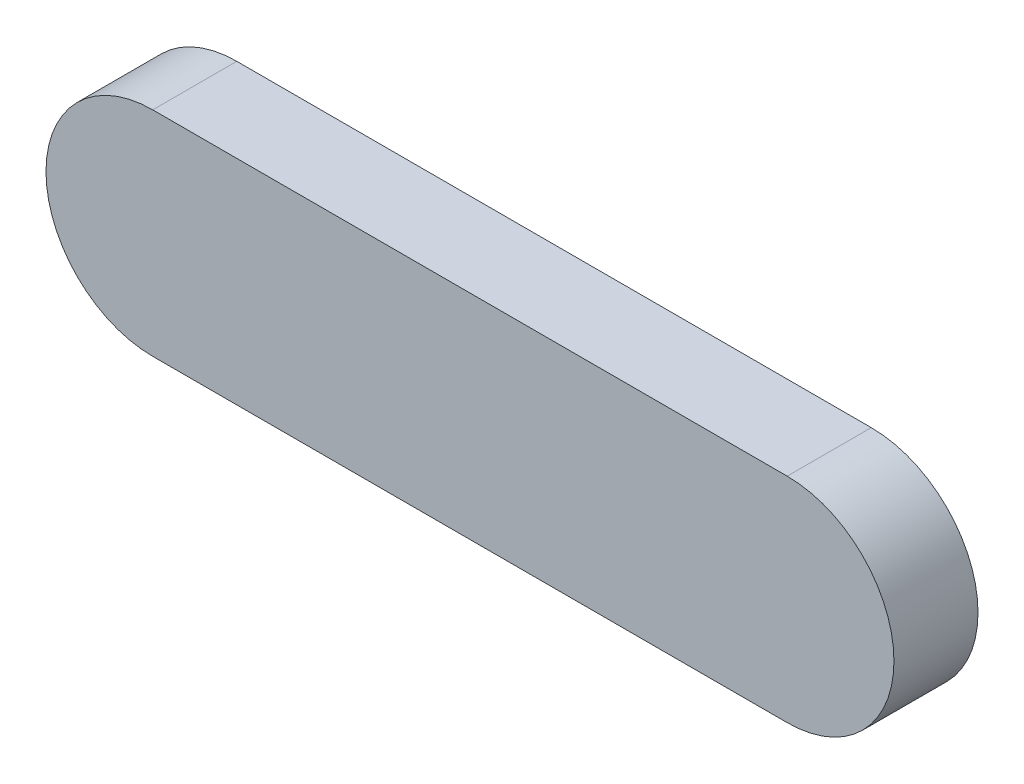
ISO-10303-21;
HEADER;
FILE_DESCRIPTION(('STEP AP214'),'2;1');
FILE_NAME('part.step','',(''),(''),'','','');
FILE_SCHEMA(('AUTOMOTIVE_DESIGN { 1 0 10303 214 1 1 1 1 }'));
ENDSEC;
DATA;
#1=APPLICATION_CONTEXT('core data for automotive mechanical design processes');
#2=APPLICATION_PROTOCOL_DEFINITION('international standard','automotive_design',2000,#1);
#3=PRODUCT_CONTEXT('',#1,'mechanical');
#4=PRODUCT('Part','Part','',(#3));
#5=PRODUCT_RELATED_PRODUCT_CATEGORY('part','',(#4));
#6=PRODUCT_DEFINITION_FORMATION('','',#4);
#7=PRODUCT_DEFINITION_CONTEXT('part definition',#1,'design');
#8=PRODUCT_DEFINITION('design','',#6,#7);
#9=PRODUCT_DEFINITION_SHAPE('','',#8);
#10=(LENGTH_UNIT() NAMED_UNIT(*) SI_UNIT(.MILLI.,.METRE.));
#11=(NAMED_UNIT(*) PLANE_ANGLE_UNIT() SI_UNIT($,.RADIAN.));
#12=(NAMED_UNIT(*) SI_UNIT($,.STERADIAN.) SOLID_ANGLE_UNIT());
#13=UNCERTAINTY_MEASURE_WITH_UNIT(LENGTH_MEASURE(1.E-05),#10,'distance_accuracy_value','');
#14=(GEOMETRIC_REPRESENTATION_CONTEXT(3) GLOBAL_UNCERTAINTY_ASSIGNED_CONTEXT((#13)) GLOBAL_UNIT_ASSIGNED_CONTEXT((#10,
#11,#12)) REPRESENTATION_CONTEXT('',''));
#15=CARTESIAN_POINT('',(0.,0.,0.));
#16=DIRECTION('',(0.,0.,1.));
#17=DIRECTION('',(1.,0.,0.));
#18=AXIS2_PLACEMENT_3D('',#15,#16,#17);
#19=CARTESIAN_POINT('',(91.29102138,53.77950382,0.));
#20=DIRECTION('',(0.,1.,0.));
#21=DIRECTION('',(1.,0.,0.));
#22=AXIS2_PLACEMENT_3D('',#19,#20,#21);
#23=PLANE('',#22);
#24=DIRECTION('',(1.,0.,0.));
#25=VECTOR('',#24,1.);
#26=CARTESIAN_POINT('',(91.29102138,53.77950382,0.1999996));
#27=LINE('',#26,#25);
#28=CARTESIAN_POINT('',(91.29102138,53.77950382,0.1999996));
#29=VERTEX_POINT('',#28);
#30=CARTESIAN_POINT('',(92.80062466,53.77950382,0.1999996));
#31=VERTEX_POINT('',#30);
#32=EDGE_CURVE('E11',#29,#31,#27,.T.);
#33=ORIENTED_EDGE('',*,*,#32,.F.);
#34=DIRECTION('',(0.,0.,1.));
#35=VECTOR('',#34,1.);
#36=CARTESIAN_POINT('',(91.29102138,53.77950382,0.));
#37=LINE('',#36,#35);
#38=CARTESIAN_POINT('',(91.29102138,53.77950382,0.));
#39=VERTEX_POINT('',#38);
#40=EDGE_CURVE('E24',#39,#29,#37,.T.);
#41=ORIENTED_EDGE('',*,*,#40,.F.);
#42=DIRECTION('',(1.,0.,0.));
#43=VECTOR('',#42,1.);
#44=CARTESIAN_POINT('',(91.29102138,53.77950382,0.));
#45=LINE('',#44,#43);
#46=CARTESIAN_POINT('',(92.80062466,53.77950382,0.));
#47=VERTEX_POINT('',#46);
#48=EDGE_CURVE('E75',#39,#47,#45,.T.);
#49=ORIENTED_EDGE('',*,*,#48,.T.);
#50=DIRECTION('',(0.,0.,1.));
#51=VECTOR('',#50,1.);
#52=CARTESIAN_POINT('',(92.80062466,53.77950382,0.));
#53=LINE('',#52,#51);
#54=EDGE_CURVE('E37',#47,#31,#53,.T.);
#55=ORIENTED_EDGE('',*,*,#54,.T.);
#56=EDGE_LOOP('',(#33,#41,#49,#55));
#57=FACE_BOUND('',#56,.T.);
#58=ADVANCED_FACE('F17',(#57),#23,.F.);
#59=CARTESIAN_POINT('',(92.80062466,54.03350382,0.));
#60=DIRECTION('',(0.,0.,-1.));
#61=DIRECTION('',(0.,-1.,0.));
#62=AXIS2_PLACEMENT_3D('',#59,#60,#61);
#63=CYLINDRICAL_SURFACE('',#62,0.254000000000003);
#64=CARTESIAN_POINT('',(92.80062466,54.03350382,0.1999996));
#65=DIRECTION('',(0.,0.,1.));
#66=DIRECTION('',(0.,-1.,0.));
#67=AXIS2_PLACEMENT_3D('',#64,#65,#66);
#68=CIRCLE('',#67,0.254000000000003);
#69=CARTESIAN_POINT('',(92.80062466,54.28750382,0.1999996));
#70=VERTEX_POINT('',#69);
#71=EDGE_CURVE('E83',#31,#70,#68,.T.);
#72=ORIENTED_EDGE('',*,*,#71,.F.);
#73=ORIENTED_EDGE('',*,*,#54,.F.);
#74=CARTESIAN_POINT('',(92.80062466,54.03350382,0.));
#75=DIRECTION('',(0.,0.,1.));
#76=DIRECTION('',(0.,-1.,0.));
#77=AXIS2_PLACEMENT_3D('',#74,#75,#76);
#78=CIRCLE('',#77,0.254000000000003);
#79=CARTESIAN_POINT('',(92.80062466,54.28750382,0.));
#80=VERTEX_POINT('',#79);
#81=EDGE_CURVE('E81',#47,#80,#78,.T.);
#82=ORIENTED_EDGE('',*,*,#81,.T.);
#83=DIRECTION('',(0.,0.,1.));
#84=VECTOR('',#83,1.);
#85=CARTESIAN_POINT('',(92.80062466,54.28750382,0.));
#86=LINE('',#85,#84);
#87=EDGE_CURVE('E67',#80,#70,#86,.T.);
#88=ORIENTED_EDGE('',*,*,#87,.T.);
#89=EDGE_LOOP('',(#72,#73,#82,#88));
#90=FACE_BOUND('',#89,.T.);
#91=ADVANCED_FACE('F89',(#90),#63,.T.);
#92=CARTESIAN_POINT('',(92.80062466,54.28750382,0.));
#93=DIRECTION('',(0.,-1.,0.));
#94=DIRECTION('',(-1.,0.,0.));
#95=AXIS2_PLACEMENT_3D('',#92,#93,#94);
#96=PLANE('',#95);
#97=DIRECTION('',(-1.,0.,0.));
#98=VECTOR('',#97,1.);
#99=CARTESIAN_POINT('',(92.80062466,54.28750382,0.1999996));
#100=LINE('',#99,#98);
#101=CARTESIAN_POINT('',(91.29102138,54.28750382,0.1999996));
#102=VERTEX_POINT('',#101);
#103=EDGE_CURVE('E71',#70,#102,#100,.T.);
#104=ORIENTED_EDGE('',*,*,#103,.F.);
#105=ORIENTED_EDGE('',*,*,#87,.F.);
#106=DIRECTION('',(-1.,0.,0.));
#107=VECTOR('',#106,1.);
#108=CARTESIAN_POINT('',(92.80062466,54.28750382,0.));
#109=LINE('',#108,#107);
#110=CARTESIAN_POINT('',(91.29102138,54.28750382,0.));
#111=VERTEX_POINT('',#110);
#112=EDGE_CURVE('E63',#80,#111,#109,.T.);
#113=ORIENTED_EDGE('',*,*,#112,.T.);
#114=DIRECTION('',(0.,0.,1.));
#115=VECTOR('',#114,1.);
#116=CARTESIAN_POINT('',(91.29102138,54.28750382,0.));
#117=LINE('',#116,#115);
#118=EDGE_CURVE('E53',#111,#102,#117,.T.);
#119=ORIENTED_EDGE('',*,*,#118,.T.);
#120=EDGE_LOOP('',(#104,#105,#113,#119));
#121=FACE_BOUND('',#120,.T.);
#122=ADVANCED_FACE('F66',(#121),#96,.F.);
#123=CARTESIAN_POINT('',(91.29102138,54.03350382,0.));
#124=DIRECTION('',(0.,0.,-1.));
#125=DIRECTION('',(0.,1.,0.));
#126=AXIS2_PLACEMENT_3D('',#123,#124,#125);
#127=CYLINDRICAL_SURFACE('',#126,0.253999999999998);
#128=CARTESIAN_POINT('',(91.29102138,54.03350382,0.1999996));
#129=DIRECTION('',(0.,0.,1.));
#130=DIRECTION('',(0.,1.,0.));
#131=AXIS2_PLACEMENT_3D('',#128,#129,#130);
#132=CIRCLE('',#131,0.253999999999998);
#133=EDGE_CURVE('E59',#102,#29,#132,.T.);
#134=ORIENTED_EDGE('',*,*,#133,.F.);
#135=ORIENTED_EDGE('',*,*,#118,.F.);
#136=CARTESIAN_POINT('',(91.29102138,54.03350382,0.));
#137=DIRECTION('',(0.,0.,1.));
#138=DIRECTION('',(0.,1.,0.));
#139=AXIS2_PLACEMENT_3D('',#136,#137,#138);
#140=CIRCLE('',#139,0.253999999999998);
#141=EDGE_CURVE('E57',#111,#39,#140,.T.);
#142=ORIENTED_EDGE('',*,*,#141,.T.);
#143=ORIENTED_EDGE('',*,*,#40,.T.);
#144=EDGE_LOOP('',(#134,#135,#142,#143));
#145=FACE_BOUND('',#144,.T.);
#146=ADVANCED_FACE('F55',(#145),#127,.T.);
#147=CARTESIAN_POINT('',(91.29102138,53.77950382,0.));
#148=DIRECTION('',(0.,0.,-1.));
#149=DIRECTION('',(-1.,0.,0.));
#150=AXIS2_PLACEMENT_3D('',#147,#148,#149);
#151=PLANE('',#150);
#152=ORIENTED_EDGE('',*,*,#141,.F.);
#153=ORIENTED_EDGE('',*,*,#112,.F.);
#154=ORIENTED_EDGE('',*,*,#81,.F.);
#155=ORIENTED_EDGE('',*,*,#48,.F.);
#156=EDGE_LOOP('',(#152,#153,#154,#155));
#157=FACE_BOUND('',#156,.T.);
#158=ADVANCED_FACE('F74',(#157),#151,.T.);
#159=CARTESIAN_POINT('',(91.29102138,53.77950382,0.1999996));
#160=DIRECTION('',(0.,0.,-1.));
#161=DIRECTION('',(-1.,0.,0.));
#162=AXIS2_PLACEMENT_3D('',#159,#160,#161);
#163=PLANE('',#162);
#164=ORIENTED_EDGE('',*,*,#32,.T.);
#165=ORIENTED_EDGE('',*,*,#71,.T.);
#166=ORIENTED_EDGE('',*,*,#103,.T.);
#167=ORIENTED_EDGE('',*,*,#133,.T.);
#168=EDGE_LOOP('',(#164,#165,#166,#167));
#169=FACE_BOUND('',#168,.T.);
#170=ADVANCED_FACE('F91',(#169),#163,.F.);
#171=CLOSED_SHELL('',(#58,#91,#122,#146,#158,#170));
#172=MANIFOLD_SOLID_BREP('B1',#171);
#173=ADVANCED_BREP_SHAPE_REPRESENTATION('',(#18,#172),#14);
#174=SHAPE_DEFINITION_REPRESENTATION(#9,#173);
ENDSEC;
END-ISO-10303-21;
